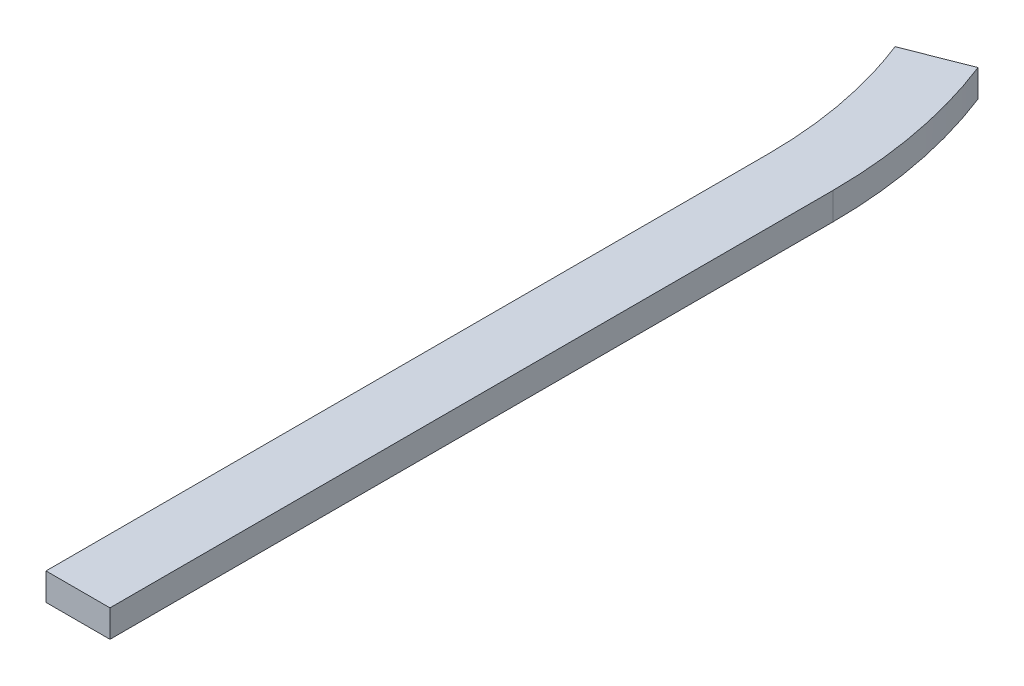
ISO-10303-21;
HEADER;
FILE_DESCRIPTION(('STEP AP214'),'2;1');
FILE_NAME('part.step','',(''),(''),'','','');
FILE_SCHEMA(('AUTOMOTIVE_DESIGN { 1 0 10303 214 1 1 1 1 }'));
ENDSEC;
DATA;
#1=APPLICATION_CONTEXT('core data for automotive mechanical design processes');
#2=APPLICATION_PROTOCOL_DEFINITION('international standard','automotive_design',2000,#1);
#3=PRODUCT_CONTEXT('',#1,'mechanical');
#4=PRODUCT('Part','Part','',(#3));
#5=PRODUCT_RELATED_PRODUCT_CATEGORY('part','',(#4));
#6=PRODUCT_DEFINITION_FORMATION('','',#4);
#7=PRODUCT_DEFINITION_CONTEXT('part definition',#1,'design');
#8=PRODUCT_DEFINITION('design','',#6,#7);
#9=PRODUCT_DEFINITION_SHAPE('','',#8);
#10=(LENGTH_UNIT() NAMED_UNIT(*) SI_UNIT(.MILLI.,.METRE.));
#11=(NAMED_UNIT(*) PLANE_ANGLE_UNIT() SI_UNIT($,.RADIAN.));
#12=(NAMED_UNIT(*) SI_UNIT($,.STERADIAN.) SOLID_ANGLE_UNIT());
#13=UNCERTAINTY_MEASURE_WITH_UNIT(LENGTH_MEASURE(1.E-05),#10,'distance_accuracy_value','');
#14=(GEOMETRIC_REPRESENTATION_CONTEXT(3) GLOBAL_UNCERTAINTY_ASSIGNED_CONTEXT((#13)) GLOBAL_UNIT_ASSIGNED_CONTEXT((#10,
#11,#12)) REPRESENTATION_CONTEXT('',''));
#15=CARTESIAN_POINT('',(0.,0.,0.));
#16=DIRECTION('',(0.,0.,1.));
#17=DIRECTION('',(1.,0.,0.));
#18=AXIS2_PLACEMENT_3D('',#15,#16,#17);
#19=CARTESIAN_POINT('',(207.3284934918,-23.14271820291,-74.04629687675));
#20=DIRECTION('',(-3.76079128358208E-05,-0.999999999292821,4.5011160592081E-08));
#21=DIRECTION('',(0.999999999292823,-3.76079128358208E-05,0.));
#22=AXIS2_PLACEMENT_3D('',#19,#20,#21);
#23=PLANE('',#22);
#24=DIRECTION('',(0.,4.50111606239119E-08,0.999999999999999));
#25=VECTOR('',#24,1.);
#26=CARTESIAN_POINT('',(205.85,-23.1426623637137,-68.8000013889246));
#27=LINE('',#26,#25);
#28=CARTESIAN_POINT('',(205.85,-23.1426623635926,-68.7973105755423));
#29=VERTEX_POINT('',#28);
#30=CARTESIAN_POINT('',(205.85,-23.1426603535201,-24.1401079697646));
#31=VERTEX_POINT('',#30);
#32=EDGE_CURVE('E71',#29,#31,#27,.T.);
#33=ORIENTED_EDGE('',*,*,#32,.F.);
#34=CARTESIAN_POINT('',(179.4760308089,-23.1416704921456,-68.76372278604));
#35=DIRECTION('',(-3.76079128358208E-05,-0.999999999292821,4.5011160592081E-08));
#36=DIRECTION('',(0.999999283064489,-3.76079397716928E-05,-0.00119685260169794));
#37=AXIS2_PLACEMENT_3D('',#34,#35,#36);
#38=ELLIPSE('',#37,26.3739905971111,26.37399057846);
#39=CARTESIAN_POINT('',(204.03034218505,-23.1425943618568,-78.390413384358));
#40=VERTEX_POINT('',#39);
#41=EDGE_CURVE('E66',#29,#40,#38,.F.);
#42=ORIENTED_EDGE('',*,*,#41,.T.);
#43=DIRECTION('',(0.931004782397453,-3.50295761186078E-05,-0.365006977914122));
#44=VECTOR('',#43,1.);
#45=CARTESIAN_POINT('',(204.030342186749,-23.1425943618568,-78.390413384653));
#46=LINE('',#45,#44);
#47=CARTESIAN_POINT('',(207.707811077948,-23.1427327286825,-79.8321909475672));
#48=VERTEX_POINT('',#47);
#49=EDGE_CURVE('E20',#40,#48,#46,.T.);
#50=ORIENTED_EDGE('',*,*,#49,.T.);
#51=CARTESIAN_POINT('',(179.4760308089,-23.1416704921456,-68.76372278604));
#52=DIRECTION('',(-3.76079128358208E-05,-0.999999999292821,4.5011160592081E-08));
#53=DIRECTION('',(0.999999283064489,-3.76079397716928E-05,-0.00119685260169794));
#54=AXIS2_PLACEMENT_3D('',#51,#52,#53);
#55=ELLIPSE('',#54,30.3239905999045,30.32399057846);
#56=CARTESIAN_POINT('',(209.79999968045,-23.1428109149577,-68.8000061123987));
#57=VERTEX_POINT('',#56);
#58=EDGE_CURVE('E102',#57,#48,#55,.F.);
#59=ORIENTED_EDGE('',*,*,#58,.F.);
#60=DIRECTION('',(1.69277580418612E-12,4.50111605602501E-08,0.999999999999999));
#61=VECTOR('',#60,1.);
#62=CARTESIAN_POINT('',(209.799999680098,-23.1428111510994,-74.04629687675));
#63=LINE('',#62,#61);
#64=CARTESIAN_POINT('',(209.799999944562,-23.1426530187421,-24.1405019340197));
#65=VERTEX_POINT('',#64);
#66=EDGE_CURVE('E106',#57,#65,#63,.T.);
#67=ORIENTED_EDGE('',*,*,#66,.T.);
#68=DIRECTION('',(0.999999999292823,-3.76079128358208E-05,0.));
#69=VECTOR('',#68,1.);
#70=CARTESIAN_POINT('',(207.328493491885,-23.1427159565745,-24.1401079697593));
#71=LINE('',#70,#69);
#72=EDGE_CURVE('E115',#65,#31,#71,.F.);
#73=ORIENTED_EDGE('',*,*,#72,.T.);
#74=EDGE_LOOP('',(#33,#42,#50,#59,#67,#73));
#75=FACE_BOUND('',#74,.T.);
#76=ADVANCED_FACE('F17',(#75),#23,.T.);
#77=CARTESIAN_POINT('',(205.8690766314,-22.29980495603,-79.11130216619));
#78=DIRECTION('',(0.365006977991386,0.,0.931004783026165));
#79=DIRECTION('',(0.931004783026165,0.,-0.365006977991386));
#80=AXIS2_PLACEMENT_3D('',#77,#78,#79);
#81=PLANE('',#80);
#82=DIRECTION('',(0.,-1.,0.));
#83=VECTOR('',#82,1.);
#84=CARTESIAN_POINT('',(204.030342184924,-54.,-78.3904133846796));
#85=LINE('',#84,#83);
#86=CARTESIAN_POINT('',(204.030342184928,-21.4569348077057,-78.39041338467));
#87=VERTEX_POINT('',#86);
#88=EDGE_CURVE('E75',#40,#87,#85,.F.);
#89=ORIENTED_EDGE('',*,*,#88,.T.);
#90=DIRECTION('',(-0.931004782492547,-3.39235632914421E-05,0.365006977776038));
#91=VECTOR('',#90,1.);
#92=CARTESIAN_POINT('',(207.707811077375,-21.4568008096307,-79.8321909475242));
#93=LINE('',#92,#91);
#94=CARTESIAN_POINT('',(207.707811077886,-21.4568008096307,-79.8321909477254));
#95=VERTEX_POINT('',#94);
#96=EDGE_CURVE('E100',#95,#87,#93,.T.);
#97=ORIENTED_EDGE('',*,*,#96,.F.);
#98=DIRECTION('',(0.,-1.,0.));
#99=VECTOR('',#98,1.);
#100=CARTESIAN_POINT('',(207.707811077993,-54.,-79.8321909474527));
#101=LINE('',#100,#99);
#102=EDGE_CURVE('E80',#48,#95,#101,.F.);
#103=ORIENTED_EDGE('',*,*,#102,.F.);
#104=ORIENTED_EDGE('',*,*,#49,.F.);
#105=EDGE_LOOP('',(#89,#97,#103,#104));
#106=FACE_BOUND('',#105,.T.);
#107=ADVANCED_FACE('F77',(#106),#81,.F.);
#108=CARTESIAN_POINT('',(179.4760308089,-54.,-68.76372278604));
#109=DIRECTION('',(0.,-1.,0.));
#110=DIRECTION('',(0.,0.,-1.));
#111=AXIS2_PLACEMENT_3D('',#108,#109,#110);
#112=CYLINDRICAL_SURFACE('',#111,26.37399057846);
#113=ORIENTED_EDGE('',*,*,#41,.F.);
#114=DIRECTION('',(0.,-0.999999114735695,0.00133061182394258));
#115=VECTOR('',#114,1.);
#116=CARTESIAN_POINT('',(205.85,-21.45702947032,-68.79955264805));
#117=LINE('',#116,#115);
#118=CARTESIAN_POINT('',(205.85,-21.4569976003277,-68.7995526904566));
#119=VERTEX_POINT('',#118);
#120=EDGE_CURVE('E86',#119,#29,#117,.T.);
#121=ORIENTED_EDGE('',*,*,#120,.F.);
#122=CARTESIAN_POINT('',(179.4760308089,-21.4578295074449,-68.76372278604));
#123=DIRECTION('',(-3.15829996816799E-05,0.999999999424596,1.23823373197299E-05));
#124=DIRECTION('',(-0.931004782490471,-3.39235632915024E-05,0.365006977781334));
#125=AXIS2_PLACEMENT_3D('',#122,#123,#124);
#126=ELLIPSE('',#125,26.3739905936357,26.37399057846);
#127=EDGE_CURVE('E84',#87,#119,#126,.F.);
#128=ORIENTED_EDGE('',*,*,#127,.F.);
#129=ORIENTED_EDGE('',*,*,#88,.F.);
#130=EDGE_LOOP('',(#113,#121,#128,#129));
#131=FACE_BOUND('',#130,.T.);
#132=ADVANCED_FACE('F82',(#131),#112,.F.);
#133=CARTESIAN_POINT('',(205.85,-54.,-68.8));
#134=DIRECTION('',(-1.,0.,0.));
#135=DIRECTION('',(0.,0.,1.));
#136=AXIS2_PLACEMENT_3D('',#133,#134,#135);
#137=PLANE('',#136);
#138=DIRECTION('',(0.,1.,0.));
#139=VECTOR('',#138,1.);
#140=CARTESIAN_POINT('',(205.85,-54.,-24.14010796977));
#141=LINE('',#140,#139);
#142=CARTESIAN_POINT('',(205.85,-21.4575490830352,-24.1401079716088));
#143=VERTEX_POINT('',#142);
#144=EDGE_CURVE('E111',#31,#143,#141,.T.);
#145=ORIENTED_EDGE('',*,*,#144,.T.);
#146=DIRECTION('',(0.,-1.23823373259056E-05,0.999999999923339));
#147=VECTOR('',#146,1.);
#148=CARTESIAN_POINT('',(205.85,-21.4569311277695,-74.0462968773282));
#149=LINE('',#148,#147);
#150=EDGE_CURVE('E96',#119,#143,#149,.T.);
#151=ORIENTED_EDGE('',*,*,#150,.F.);
#152=ORIENTED_EDGE('',*,*,#120,.T.);
#153=ORIENTED_EDGE('',*,*,#32,.T.);
#154=EDGE_LOOP('',(#145,#151,#152,#153));
#155=FACE_BOUND('',#154,.T.);
#156=ADVANCED_FACE('F121',(#155),#137,.T.);
#157=CARTESIAN_POINT('',(207.825,-22.29977584945,-24.14010796977));
#158=DIRECTION('',(0.,0.,-1.));
#159=DIRECTION('',(-1.,0.,0.));
#160=AXIS2_PLACEMENT_3D('',#157,#158,#159);
#161=PLANE('',#160);
#162=ORIENTED_EDGE('',*,*,#144,.F.);
#163=ORIENTED_EDGE('',*,*,#72,.F.);
#164=DIRECTION('',(0.,1.,0.));
#165=VECTOR('',#164,1.);
#166=CARTESIAN_POINT('',(209.8000000028,-22.29977584945,-24.14010796977));
#167=LINE('',#166,#165);
#168=CARTESIAN_POINT('',(209.800000005344,-21.4574243301862,-24.1401079716088));
#169=VERTEX_POINT('',#168);
#170=EDGE_CURVE('E104',#65,#169,#167,.T.);
#171=ORIENTED_EDGE('',*,*,#170,.T.);
#172=DIRECTION('',(-0.999999999501257,-3.15829996841011E-05,0.));
#173=VECTOR('',#172,1.);
#174=CARTESIAN_POINT('',(207.328493511317,-21.4575023877751,-24.1401079734477));
#175=LINE('',#174,#173);
#176=EDGE_CURVE('E93',#143,#169,#175,.F.);
#177=ORIENTED_EDGE('',*,*,#176,.F.);
#178=EDGE_LOOP('',(#162,#163,#171,#177));
#179=FACE_BOUND('',#178,.T.);
#180=ADVANCED_FACE('F126',(#179),#161,.F.);
#181=CARTESIAN_POINT('',(209.8,-54.,-68.8));
#182=DIRECTION('',(-1.,0.,0.));
#183=DIRECTION('',(0.,0.,1.));
#184=AXIS2_PLACEMENT_3D('',#181,#182,#183);
#185=PLANE('',#184);
#186=ORIENTED_EDGE('',*,*,#66,.F.);
#187=DIRECTION('',(0.,-1.,0.));
#188=VECTOR('',#187,1.);
#189=CARTESIAN_POINT('',(209.799999680849,-54.,-68.8000057793501));
#190=LINE('',#189,#188);
#191=CARTESIAN_POINT('',(209.799999757818,-21.456871336272,-68.8000057796206));
#192=VERTEX_POINT('',#191);
#193=EDGE_CURVE('E35',#192,#57,#190,.T.);
#194=ORIENTED_EDGE('',*,*,#193,.F.);
#195=DIRECTION('',(3.91071355657464E-10,-1.23823373135543E-05,0.999999999923339));
#196=VECTOR('',#195,1.);
#197=CARTESIAN_POINT('',(209.799999986676,-21.4568063749211,-74.04629687675));
#198=LINE('',#197,#196);
#199=EDGE_CURVE('E26',#169,#192,#198,.F.);
#200=ORIENTED_EDGE('',*,*,#199,.F.);
#201=ORIENTED_EDGE('',*,*,#170,.F.);
#202=EDGE_LOOP('',(#186,#194,#200,#201));
#203=FACE_BOUND('',#202,.T.);
#204=ADVANCED_FACE('F133',(#203),#185,.F.);
#205=CARTESIAN_POINT('',(179.4760308089,-54.,-68.76372278604));
#206=DIRECTION('',(0.,-1.,0.));
#207=DIRECTION('',(0.,0.,-1.));
#208=AXIS2_PLACEMENT_3D('',#205,#206,#207);
#209=CYLINDRICAL_SURFACE('',#208,30.32399057846);
#210=ORIENTED_EDGE('',*,*,#102,.T.);
#211=CARTESIAN_POINT('',(179.4760308089,-21.4578295074449,-68.76372278604));
#212=DIRECTION('',(-3.15829996816799E-05,0.999999999424596,1.23823373197299E-05));
#213=DIRECTION('',(-0.931004782490471,-3.39235632915024E-05,0.365006977781334));
#214=AXIS2_PLACEMENT_3D('',#211,#212,#213);
#215=ELLIPSE('',#214,30.3239905959085,30.32399057846);
#216=EDGE_CURVE('E11',#192,#95,#215,.T.);
#217=ORIENTED_EDGE('',*,*,#216,.F.);
#218=ORIENTED_EDGE('',*,*,#193,.T.);
#219=ORIENTED_EDGE('',*,*,#58,.T.);
#220=EDGE_LOOP('',(#210,#217,#218,#219));
#221=FACE_BOUND('',#220,.T.);
#222=ADVANCED_FACE('F131',(#221),#209,.T.);
#223=CARTESIAN_POINT('',(207.3284934918,-21.45688443251,-74.04629687675));
#224=DIRECTION('',(-3.15829996816799E-05,0.999999999424596,1.23823373197299E-05));
#225=DIRECTION('',(-0.999999999501257,-3.15829996841011E-05,0.));
#226=AXIS2_PLACEMENT_3D('',#223,#224,#225);
#227=PLANE('',#226);
#228=ORIENTED_EDGE('',*,*,#199,.T.);
#229=ORIENTED_EDGE('',*,*,#216,.T.);
#230=ORIENTED_EDGE('',*,*,#96,.T.);
#231=ORIENTED_EDGE('',*,*,#127,.T.);
#232=ORIENTED_EDGE('',*,*,#150,.T.);
#233=ORIENTED_EDGE('',*,*,#176,.T.);
#234=EDGE_LOOP('',(#228,#229,#230,#231,#232,#233));
#235=FACE_BOUND('',#234,.T.);
#236=ADVANCED_FACE('F129',(#235),#227,.T.);
#237=CLOSED_SHELL('',(#76,#107,#132,#156,#180,#204,#222,#236));
#238=MANIFOLD_SOLID_BREP('B1',#237);
#239=ADVANCED_BREP_SHAPE_REPRESENTATION('',(#18,#238),#14);
#240=SHAPE_DEFINITION_REPRESENTATION(#9,#239);
ENDSEC;
END-ISO-10303-21;
